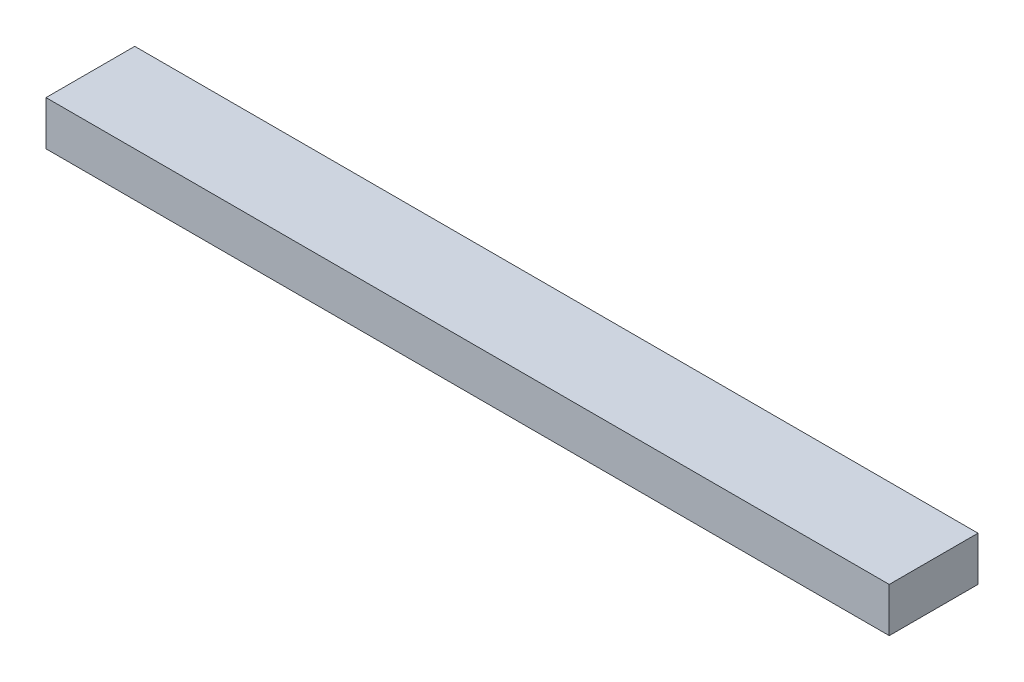
ISO-10303-21;
HEADER;
FILE_DESCRIPTION(('STEP AP214'),'2;1');
FILE_NAME('part.step','',(''),(''),'','','');
FILE_SCHEMA(('AUTOMOTIVE_DESIGN { 1 0 10303 214 1 1 1 1 }'));
ENDSEC;
DATA;
#1=APPLICATION_CONTEXT('core data for automotive mechanical design processes');
#2=APPLICATION_PROTOCOL_DEFINITION('international standard','automotive_design',2000,#1);
#3=PRODUCT_CONTEXT('',#1,'mechanical');
#4=PRODUCT('Part','Part','',(#3));
#5=PRODUCT_RELATED_PRODUCT_CATEGORY('part','',(#4));
#6=PRODUCT_DEFINITION_FORMATION('','',#4);
#7=PRODUCT_DEFINITION_CONTEXT('part definition',#1,'design');
#8=PRODUCT_DEFINITION('design','',#6,#7);
#9=PRODUCT_DEFINITION_SHAPE('','',#8);
#10=(LENGTH_UNIT() NAMED_UNIT(*) SI_UNIT(.MILLI.,.METRE.));
#11=(NAMED_UNIT(*) PLANE_ANGLE_UNIT() SI_UNIT($,.RADIAN.));
#12=(NAMED_UNIT(*) SI_UNIT($,.STERADIAN.) SOLID_ANGLE_UNIT());
#13=UNCERTAINTY_MEASURE_WITH_UNIT(LENGTH_MEASURE(1.E-05),#10,'distance_accuracy_value','');
#14=(GEOMETRIC_REPRESENTATION_CONTEXT(3) GLOBAL_UNCERTAINTY_ASSIGNED_CONTEXT((#13)) GLOBAL_UNIT_ASSIGNED_CONTEXT((#10,
#11,#12)) REPRESENTATION_CONTEXT('',''));
#15=CARTESIAN_POINT('',(0.,0.,0.));
#16=DIRECTION('',(0.,0.,1.));
#17=DIRECTION('',(1.,0.,0.));
#18=AXIS2_PLACEMENT_3D('',#15,#16,#17);
#19=CARTESIAN_POINT('',(0.,12.7,0.));
#20=DIRECTION('',(1.,0.,0.));
#21=DIRECTION('',(0.,0.,-1.));
#22=AXIS2_PLACEMENT_3D('',#19,#20,#21);
#23=PLANE('',#22);
#24=DIRECTION('',(0.,0.,1.));
#25=VECTOR('',#24,1.);
#26=CARTESIAN_POINT('',(0.,0.,0.));
#27=LINE('',#26,#25);
#28=CARTESIAN_POINT('',(0.,0.,-25.4));
#29=VERTEX_POINT('',#28);
#30=CARTESIAN_POINT('',(0.,0.,0.));
#31=VERTEX_POINT('',#30);
#32=EDGE_CURVE('E107',#29,#31,#27,.T.);
#33=ORIENTED_EDGE('',*,*,#32,.T.);
#34=DIRECTION('',(0.,-1.,0.));
#35=VECTOR('',#34,1.);
#36=CARTESIAN_POINT('',(0.,12.7,0.));
#37=LINE('',#36,#35);
#38=CARTESIAN_POINT('',(0.,12.7,0.));
#39=VERTEX_POINT('',#38);
#40=EDGE_CURVE('E11',#39,#31,#37,.T.);
#41=ORIENTED_EDGE('',*,*,#40,.F.);
#42=DIRECTION('',(0.,0.,1.));
#43=VECTOR('',#42,1.);
#44=CARTESIAN_POINT('',(0.,12.7,0.));
#45=LINE('',#44,#43);
#46=CARTESIAN_POINT('',(0.,12.7,-25.4));
#47=VERTEX_POINT('',#46);
#48=EDGE_CURVE('E91',#47,#39,#45,.T.);
#49=ORIENTED_EDGE('',*,*,#48,.F.);
#50=DIRECTION('',(0.,-1.,0.));
#51=VECTOR('',#50,1.);
#52=CARTESIAN_POINT('',(0.,12.7,-25.4));
#53=LINE('',#52,#51);
#54=EDGE_CURVE('E103',#47,#29,#53,.T.);
#55=ORIENTED_EDGE('',*,*,#54,.T.);
#56=EDGE_LOOP('',(#33,#41,#49,#55));
#57=FACE_BOUND('',#56,.T.);
#58=ADVANCED_FACE('F39',(#57),#23,.F.);
#59=CARTESIAN_POINT('',(0.,12.7,0.));
#60=DIRECTION('',(0.,0.,-1.));
#61=DIRECTION('',(-1.,0.,0.));
#62=AXIS2_PLACEMENT_3D('',#59,#60,#61);
#63=PLANE('',#62);
#64=DIRECTION('',(1.,0.,0.));
#65=VECTOR('',#64,1.);
#66=CARTESIAN_POINT('',(0.,0.,0.));
#67=LINE('',#66,#65);
#68=CARTESIAN_POINT('',(241.3,0.,0.));
#69=VERTEX_POINT('',#68);
#70=EDGE_CURVE('E96',#31,#69,#67,.T.);
#71=ORIENTED_EDGE('',*,*,#70,.T.);
#72=DIRECTION('',(0.,-1.,0.));
#73=VECTOR('',#72,1.);
#74=CARTESIAN_POINT('',(241.3,12.7,0.));
#75=LINE('',#74,#73);
#76=CARTESIAN_POINT('',(241.3,12.7,0.));
#77=VERTEX_POINT('',#76);
#78=EDGE_CURVE('E48',#77,#69,#75,.T.);
#79=ORIENTED_EDGE('',*,*,#78,.F.);
#80=DIRECTION('',(1.,0.,0.));
#81=VECTOR('',#80,1.);
#82=CARTESIAN_POINT('',(0.,12.7,0.));
#83=LINE('',#82,#81);
#84=EDGE_CURVE('E86',#39,#77,#83,.T.);
#85=ORIENTED_EDGE('',*,*,#84,.F.);
#86=ORIENTED_EDGE('',*,*,#40,.T.);
#87=EDGE_LOOP('',(#71,#79,#85,#86));
#88=FACE_BOUND('',#87,.T.);
#89=ADVANCED_FACE('F95',(#88),#63,.F.);
#90=CARTESIAN_POINT('',(241.3,12.7,0.));
#91=DIRECTION('',(-1.,0.,0.));
#92=DIRECTION('',(0.,0.,1.));
#93=AXIS2_PLACEMENT_3D('',#90,#91,#92);
#94=PLANE('',#93);
#95=DIRECTION('',(0.,0.,-1.));
#96=VECTOR('',#95,1.);
#97=CARTESIAN_POINT('',(241.3,0.,0.));
#98=LINE('',#97,#96);
#99=CARTESIAN_POINT('',(241.3,0.,-25.4));
#100=VERTEX_POINT('',#99);
#101=EDGE_CURVE('E73',#69,#100,#98,.T.);
#102=ORIENTED_EDGE('',*,*,#101,.T.);
#103=DIRECTION('',(0.,-1.,0.));
#104=VECTOR('',#103,1.);
#105=CARTESIAN_POINT('',(241.3,12.7,-25.4));
#106=LINE('',#105,#104);
#107=CARTESIAN_POINT('',(241.3,12.7,-25.4));
#108=VERTEX_POINT('',#107);
#109=EDGE_CURVE('E98',#108,#100,#106,.T.);
#110=ORIENTED_EDGE('',*,*,#109,.F.);
#111=DIRECTION('',(0.,0.,-1.));
#112=VECTOR('',#111,1.);
#113=CARTESIAN_POINT('',(241.3,12.7,0.));
#114=LINE('',#113,#112);
#115=EDGE_CURVE('E89',#77,#108,#114,.T.);
#116=ORIENTED_EDGE('',*,*,#115,.F.);
#117=ORIENTED_EDGE('',*,*,#78,.T.);
#118=EDGE_LOOP('',(#102,#110,#116,#117));
#119=FACE_BOUND('',#118,.T.);
#120=ADVANCED_FACE('F99',(#119),#94,.F.);
#121=CARTESIAN_POINT('',(0.,12.7,-25.4));
#122=DIRECTION('',(0.,0.,1.));
#123=DIRECTION('',(1.,0.,0.));
#124=AXIS2_PLACEMENT_3D('',#121,#122,#123);
#125=PLANE('',#124);
#126=DIRECTION('',(-1.,0.,0.));
#127=VECTOR('',#126,1.);
#128=CARTESIAN_POINT('',(0.,0.,-25.4));
#129=LINE('',#128,#127);
#130=EDGE_CURVE('E79',#100,#29,#129,.T.);
#131=ORIENTED_EDGE('',*,*,#130,.T.);
#132=ORIENTED_EDGE('',*,*,#54,.F.);
#133=DIRECTION('',(-1.,0.,0.));
#134=VECTOR('',#133,1.);
#135=CARTESIAN_POINT('',(0.,12.7,-25.4));
#136=LINE('',#135,#134);
#137=EDGE_CURVE('E56',#108,#47,#136,.T.);
#138=ORIENTED_EDGE('',*,*,#137,.F.);
#139=ORIENTED_EDGE('',*,*,#109,.T.);
#140=EDGE_LOOP('',(#131,#132,#138,#139));
#141=FACE_BOUND('',#140,.T.);
#142=ADVANCED_FACE('F120',(#141),#125,.F.);
#143=CARTESIAN_POINT('',(0.,12.7,0.));
#144=DIRECTION('',(0.,-1.,0.));
#145=DIRECTION('',(0.,0.,-1.));
#146=AXIS2_PLACEMENT_3D('',#143,#144,#145);
#147=PLANE('',#146);
#148=ORIENTED_EDGE('',*,*,#48,.T.);
#149=ORIENTED_EDGE('',*,*,#84,.T.);
#150=ORIENTED_EDGE('',*,*,#115,.T.);
#151=ORIENTED_EDGE('',*,*,#137,.T.);
#152=EDGE_LOOP('',(#148,#149,#150,#151));
#153=FACE_BOUND('',#152,.T.);
#154=ADVANCED_FACE('F87',(#153),#147,.F.);
#155=CARTESIAN_POINT('',(0.,0.,0.));
#156=DIRECTION('',(0.,-1.,0.));
#157=DIRECTION('',(0.,0.,-1.));
#158=AXIS2_PLACEMENT_3D('',#155,#156,#157);
#159=PLANE('',#158);
#160=ORIENTED_EDGE('',*,*,#32,.F.);
#161=ORIENTED_EDGE('',*,*,#130,.F.);
#162=ORIENTED_EDGE('',*,*,#101,.F.);
#163=ORIENTED_EDGE('',*,*,#70,.F.);
#164=EDGE_LOOP('',(#160,#161,#162,#163));
#165=FACE_BOUND('',#164,.T.);
#166=ADVANCED_FACE('F123',(#165),#159,.T.);
#167=CLOSED_SHELL('',(#58,#89,#120,#142,#154,#166));
#168=MANIFOLD_SOLID_BREP('B2',#167);
#169=ADVANCED_BREP_SHAPE_REPRESENTATION('',(#18,#168),#14);
#170=SHAPE_DEFINITION_REPRESENTATION(#9,#169);
ENDSEC;
END-ISO-10303-21;
